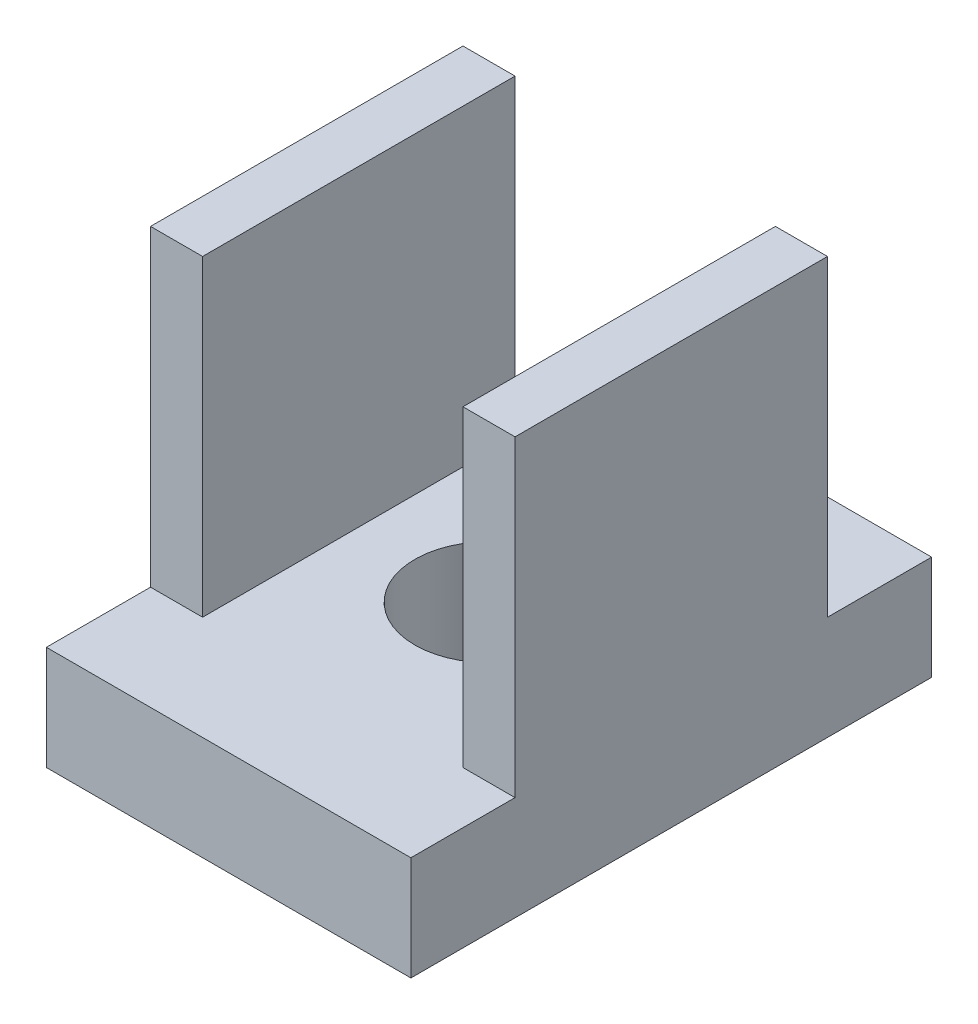
ISO-10303-21;
HEADER;
FILE_DESCRIPTION(('STEP AP214'),'2;1');
FILE_NAME('part.step','',(''),(''),'','','');
FILE_SCHEMA(('AUTOMOTIVE_DESIGN { 1 0 10303 214 1 1 1 1 }'));
ENDSEC;
DATA;
#1=APPLICATION_CONTEXT('core data for automotive mechanical design processes');
#2=APPLICATION_PROTOCOL_DEFINITION('international standard','automotive_design',2000,#1);
#3=PRODUCT_CONTEXT('',#1,'mechanical');
#4=PRODUCT('Part','Part','',(#3));
#5=PRODUCT_RELATED_PRODUCT_CATEGORY('part','',(#4));
#6=PRODUCT_DEFINITION_FORMATION('','',#4);
#7=PRODUCT_DEFINITION_CONTEXT('part definition',#1,'design');
#8=PRODUCT_DEFINITION('design','',#6,#7);
#9=PRODUCT_DEFINITION_SHAPE('','',#8);
#10=(LENGTH_UNIT() NAMED_UNIT(*) SI_UNIT(.MILLI.,.METRE.));
#11=(NAMED_UNIT(*) PLANE_ANGLE_UNIT() SI_UNIT($,.RADIAN.));
#12=(NAMED_UNIT(*) SI_UNIT($,.STERADIAN.) SOLID_ANGLE_UNIT());
#13=UNCERTAINTY_MEASURE_WITH_UNIT(LENGTH_MEASURE(1.E-05),#10,'distance_accuracy_value','');
#14=(GEOMETRIC_REPRESENTATION_CONTEXT(3) GLOBAL_UNCERTAINTY_ASSIGNED_CONTEXT((#13)) GLOBAL_UNIT_ASSIGNED_CONTEXT((#10,
#11,#12)) REPRESENTATION_CONTEXT('',''));
#15=CARTESIAN_POINT('',(0.,0.,0.));
#16=DIRECTION('',(0.,0.,1.));
#17=DIRECTION('',(1.,0.,0.));
#18=AXIS2_PLACEMENT_3D('',#15,#16,#17);
#19=CARTESIAN_POINT('',(0.,2.,0.));
#20=DIRECTION('',(0.,1.,0.));
#21=DIRECTION('',(0.,0.,1.));
#22=AXIS2_PLACEMENT_3D('',#19,#20,#21);
#23=PLANE('',#22);
#24=CARTESIAN_POINT('',(0.,2.,0.));
#25=DIRECTION('',(0.,1.,0.));
#26=DIRECTION('',(0.,0.,1.));
#27=AXIS2_PLACEMENT_3D('',#24,#25,#26);
#28=CIRCLE('',#27,1.425);
#29=CARTESIAN_POINT('',(0.,2.,1.425));
#30=VERTEX_POINT('',#29);
#31=EDGE_CURVE('E200',#30,#30,#28,.T.);
#32=ORIENTED_EDGE('',*,*,#31,.F.);
#33=EDGE_LOOP('',(#32));
#34=FACE_BOUND('',#33,.T.);
#35=DIRECTION('',(0.,0.,1.));
#36=VECTOR('',#35,1.);
#37=CARTESIAN_POINT('',(2.5,2.,-3.));
#38=LINE('',#37,#36);
#39=CARTESIAN_POINT('',(2.5,2.,-3.));
#40=VERTEX_POINT('',#39);
#41=CARTESIAN_POINT('',(2.5,2.,3.));
#42=VERTEX_POINT('',#41);
#43=EDGE_CURVE('E410',#40,#42,#38,.T.);
#44=ORIENTED_EDGE('',*,*,#43,.F.);
#45=DIRECTION('',(-1.,0.,0.));
#46=VECTOR('',#45,1.);
#47=CARTESIAN_POINT('',(3.5,2.,-3.));
#48=LINE('',#47,#46);
#49=CARTESIAN_POINT('',(3.5,2.,-3.));
#50=VERTEX_POINT('',#49);
#51=EDGE_CURVE('E267',#50,#40,#48,.T.);
#52=ORIENTED_EDGE('',*,*,#51,.F.);
#53=DIRECTION('',(0.,0.,-1.));
#54=VECTOR('',#53,1.);
#55=CARTESIAN_POINT('',(3.5,2.,-5.));
#56=LINE('',#55,#54);
#57=CARTESIAN_POINT('',(3.5,2.,-5.));
#58=VERTEX_POINT('',#57);
#59=EDGE_CURVE('E155',#50,#58,#56,.T.);
#60=ORIENTED_EDGE('',*,*,#59,.T.);
#61=DIRECTION('',(-1.,0.,0.));
#62=VECTOR('',#61,1.);
#63=CARTESIAN_POINT('',(-3.5,2.,-5.));
#64=LINE('',#63,#62);
#65=CARTESIAN_POINT('',(-3.5,2.,-5.));
#66=VERTEX_POINT('',#65);
#67=EDGE_CURVE('E213',#58,#66,#64,.T.);
#68=ORIENTED_EDGE('',*,*,#67,.T.);
#69=DIRECTION('',(0.,0.,1.));
#70=VECTOR('',#69,1.);
#71=CARTESIAN_POINT('',(-3.5,2.,-5.));
#72=LINE('',#71,#70);
#73=CARTESIAN_POINT('',(-3.5,2.,-3.));
#74=VERTEX_POINT('',#73);
#75=EDGE_CURVE('E217',#66,#74,#72,.T.);
#76=ORIENTED_EDGE('',*,*,#75,.T.);
#77=DIRECTION('',(-1.,0.,0.));
#78=VECTOR('',#77,1.);
#79=CARTESIAN_POINT('',(-3.5,2.,-3.));
#80=LINE('',#79,#78);
#81=CARTESIAN_POINT('',(-2.5,2.,-3.));
#82=VERTEX_POINT('',#81);
#83=EDGE_CURVE('E63',#82,#74,#80,.T.);
#84=ORIENTED_EDGE('',*,*,#83,.F.);
#85=DIRECTION('',(0.,0.,-1.));
#86=VECTOR('',#85,1.);
#87=CARTESIAN_POINT('',(-2.5,2.,3.));
#88=LINE('',#87,#86);
#89=CARTESIAN_POINT('',(-2.5,2.,3.));
#90=VERTEX_POINT('',#89);
#91=EDGE_CURVE('E162',#90,#82,#88,.T.);
#92=ORIENTED_EDGE('',*,*,#91,.F.);
#93=DIRECTION('',(1.,0.,0.));
#94=VECTOR('',#93,1.);
#95=CARTESIAN_POINT('',(-3.5,2.,3.));
#96=LINE('',#95,#94);
#97=CARTESIAN_POINT('',(-3.5,2.,3.));
#98=VERTEX_POINT('',#97);
#99=EDGE_CURVE('E157',#98,#90,#96,.T.);
#100=ORIENTED_EDGE('',*,*,#99,.F.);
#101=CARTESIAN_POINT('',(-3.5,2.,5.));
#102=VERTEX_POINT('',#101);
#103=EDGE_CURVE('E216',#98,#102,#72,.T.);
#104=ORIENTED_EDGE('',*,*,#103,.T.);
#105=DIRECTION('',(1.,0.,0.));
#106=VECTOR('',#105,1.);
#107=CARTESIAN_POINT('',(-3.5,2.,5.));
#108=LINE('',#107,#106);
#109=CARTESIAN_POINT('',(3.5,2.,5.));
#110=VERTEX_POINT('',#109);
#111=EDGE_CURVE('E220',#102,#110,#108,.T.);
#112=ORIENTED_EDGE('',*,*,#111,.T.);
#113=CARTESIAN_POINT('',(3.5,2.,3.));
#114=VERTEX_POINT('',#113);
#115=EDGE_CURVE('E209',#110,#114,#56,.T.);
#116=ORIENTED_EDGE('',*,*,#115,.T.);
#117=DIRECTION('',(1.,0.,0.));
#118=VECTOR('',#117,1.);
#119=CARTESIAN_POINT('',(3.5,2.,3.));
#120=LINE('',#119,#118);
#121=EDGE_CURVE('E150',#42,#114,#120,.T.);
#122=ORIENTED_EDGE('',*,*,#121,.F.);
#123=EDGE_LOOP('',(#44,#52,#60,#68,#76,#84,#92,#100,#104,#112,#116,#122));
#124=FACE_BOUND('',#123,.T.);
#125=ADVANCED_FACE('F39',(#34,#124),#23,.T.);
#126=CARTESIAN_POINT('',(3.5,2.,-5.));
#127=DIRECTION('',(-1.,0.,0.));
#128=DIRECTION('',(0.,0.,1.));
#129=AXIS2_PLACEMENT_3D('',#126,#127,#128);
#130=PLANE('',#129);
#131=DIRECTION('',(0.,0.,-1.));
#132=VECTOR('',#131,1.);
#133=CARTESIAN_POINT('',(3.5,0.,-5.));
#134=LINE('',#133,#132);
#135=CARTESIAN_POINT('',(3.5,0.,5.));
#136=VERTEX_POINT('',#135);
#137=CARTESIAN_POINT('',(3.5,0.,-5.));
#138=VERTEX_POINT('',#137);
#139=EDGE_CURVE('E205',#136,#138,#134,.T.);
#140=ORIENTED_EDGE('',*,*,#139,.T.);
#141=DIRECTION('',(0.,-1.,0.));
#142=VECTOR('',#141,1.);
#143=CARTESIAN_POINT('',(3.5,2.,-5.));
#144=LINE('',#143,#142);
#145=EDGE_CURVE('E11',#58,#138,#144,.T.);
#146=ORIENTED_EDGE('',*,*,#145,.F.);
#147=ORIENTED_EDGE('',*,*,#59,.F.);
#148=DIRECTION('',(0.,-1.,0.));
#149=VECTOR('',#148,1.);
#150=CARTESIAN_POINT('',(3.5,8.,-3.));
#151=LINE('',#150,#149);
#152=CARTESIAN_POINT('',(3.5,8.,-3.));
#153=VERTEX_POINT('',#152);
#154=EDGE_CURVE('E133',#153,#50,#151,.T.);
#155=ORIENTED_EDGE('',*,*,#154,.F.);
#156=DIRECTION('',(0.,0.,-1.));
#157=VECTOR('',#156,1.);
#158=CARTESIAN_POINT('',(3.5,8.,-3.));
#159=LINE('',#158,#157);
#160=CARTESIAN_POINT('',(3.5,8.,3.));
#161=VERTEX_POINT('',#160);
#162=EDGE_CURVE('E141',#161,#153,#159,.T.);
#163=ORIENTED_EDGE('',*,*,#162,.F.);
#164=DIRECTION('',(0.,-1.,0.));
#165=VECTOR('',#164,1.);
#166=CARTESIAN_POINT('',(3.5,8.,3.));
#167=LINE('',#166,#165);
#168=EDGE_CURVE('E260',#161,#114,#167,.T.);
#169=ORIENTED_EDGE('',*,*,#168,.T.);
#170=ORIENTED_EDGE('',*,*,#115,.F.);
#171=DIRECTION('',(0.,-1.,0.));
#172=VECTOR('',#171,1.);
#173=CARTESIAN_POINT('',(3.5,2.,5.));
#174=LINE('',#173,#172);
#175=EDGE_CURVE('E223',#110,#136,#174,.T.);
#176=ORIENTED_EDGE('',*,*,#175,.T.);
#177=EDGE_LOOP('',(#140,#146,#147,#155,#163,#169,#170,#176));
#178=FACE_BOUND('',#177,.T.);
#179=ADVANCED_FACE('F41',(#178),#130,.F.);
#180=CARTESIAN_POINT('',(-3.5,2.,-5.));
#181=DIRECTION('',(0.,0.,1.));
#182=DIRECTION('',(1.,0.,0.));
#183=AXIS2_PLACEMENT_3D('',#180,#181,#182);
#184=PLANE('',#183);
#185=DIRECTION('',(-1.,0.,0.));
#186=VECTOR('',#185,1.);
#187=CARTESIAN_POINT('',(-3.5,0.,-5.));
#188=LINE('',#187,#186);
#189=CARTESIAN_POINT('',(-3.5,0.,-5.));
#190=VERTEX_POINT('',#189);
#191=EDGE_CURVE('E226',#138,#190,#188,.T.);
#192=ORIENTED_EDGE('',*,*,#191,.T.);
#193=DIRECTION('',(0.,-1.,0.));
#194=VECTOR('',#193,1.);
#195=CARTESIAN_POINT('',(-3.5,2.,-5.));
#196=LINE('',#195,#194);
#197=EDGE_CURVE('E48',#66,#190,#196,.T.);
#198=ORIENTED_EDGE('',*,*,#197,.F.);
#199=ORIENTED_EDGE('',*,*,#67,.F.);
#200=ORIENTED_EDGE('',*,*,#145,.T.);
#201=EDGE_LOOP('',(#192,#198,#199,#200));
#202=FACE_BOUND('',#201,.T.);
#203=ADVANCED_FACE('F268',(#202),#184,.F.);
#204=CARTESIAN_POINT('',(-3.5,2.,-5.));
#205=DIRECTION('',(1.,0.,0.));
#206=DIRECTION('',(0.,0.,-1.));
#207=AXIS2_PLACEMENT_3D('',#204,#205,#206);
#208=PLANE('',#207);
#209=DIRECTION('',(0.,0.,1.));
#210=VECTOR('',#209,1.);
#211=CARTESIAN_POINT('',(-3.5,0.,-5.));
#212=LINE('',#211,#210);
#213=CARTESIAN_POINT('',(-3.5,0.,5.));
#214=VERTEX_POINT('',#213);
#215=EDGE_CURVE('E229',#190,#214,#212,.T.);
#216=ORIENTED_EDGE('',*,*,#215,.T.);
#217=DIRECTION('',(0.,-1.,0.));
#218=VECTOR('',#217,1.);
#219=CARTESIAN_POINT('',(-3.5,2.,5.));
#220=LINE('',#219,#218);
#221=EDGE_CURVE('E238',#102,#214,#220,.T.);
#222=ORIENTED_EDGE('',*,*,#221,.F.);
#223=ORIENTED_EDGE('',*,*,#103,.F.);
#224=DIRECTION('',(0.,-1.,0.));
#225=VECTOR('',#224,1.);
#226=CARTESIAN_POINT('',(-3.5,8.,3.));
#227=LINE('',#226,#225);
#228=CARTESIAN_POINT('',(-3.5,8.,3.));
#229=VERTEX_POINT('',#228);
#230=EDGE_CURVE('E196',#229,#98,#227,.T.);
#231=ORIENTED_EDGE('',*,*,#230,.F.);
#232=DIRECTION('',(0.,0.,1.));
#233=VECTOR('',#232,1.);
#234=CARTESIAN_POINT('',(-3.5,8.,3.));
#235=LINE('',#234,#233);
#236=CARTESIAN_POINT('',(-3.5,8.,-3.));
#237=VERTEX_POINT('',#236);
#238=EDGE_CURVE('E167',#237,#229,#235,.T.);
#239=ORIENTED_EDGE('',*,*,#238,.F.);
#240=DIRECTION('',(0.,-1.,0.));
#241=VECTOR('',#240,1.);
#242=CARTESIAN_POINT('',(-3.5,8.,-3.));
#243=LINE('',#242,#241);
#244=EDGE_CURVE('E179',#237,#74,#243,.T.);
#245=ORIENTED_EDGE('',*,*,#244,.T.);
#246=ORIENTED_EDGE('',*,*,#75,.F.);
#247=ORIENTED_EDGE('',*,*,#197,.T.);
#248=EDGE_LOOP('',(#216,#222,#223,#231,#239,#245,#246,#247));
#249=FACE_BOUND('',#248,.T.);
#250=ADVANCED_FACE('F247',(#249),#208,.F.);
#251=CARTESIAN_POINT('',(-3.5,2.,5.));
#252=DIRECTION('',(0.,0.,-1.));
#253=DIRECTION('',(-1.,0.,0.));
#254=AXIS2_PLACEMENT_3D('',#251,#252,#253);
#255=PLANE('',#254);
#256=DIRECTION('',(1.,0.,0.));
#257=VECTOR('',#256,1.);
#258=CARTESIAN_POINT('',(-3.5,0.,5.));
#259=LINE('',#258,#257);
#260=EDGE_CURVE('E232',#214,#136,#259,.T.);
#261=ORIENTED_EDGE('',*,*,#260,.T.);
#262=ORIENTED_EDGE('',*,*,#175,.F.);
#263=ORIENTED_EDGE('',*,*,#111,.F.);
#264=ORIENTED_EDGE('',*,*,#221,.T.);
#265=EDGE_LOOP('',(#261,#262,#263,#264));
#266=FACE_BOUND('',#265,.T.);
#267=ADVANCED_FACE('F257',(#266),#255,.F.);
#268=CARTESIAN_POINT('',(0.,0.,0.));
#269=DIRECTION('',(0.,1.,0.));
#270=DIRECTION('',(0.,0.,1.));
#271=AXIS2_PLACEMENT_3D('',#268,#269,#270);
#272=PLANE('',#271);
#273=CARTESIAN_POINT('',(0.,0.,0.));
#274=DIRECTION('',(0.,1.,0.));
#275=DIRECTION('',(0.,0.,1.));
#276=AXIS2_PLACEMENT_3D('',#273,#274,#275);
#277=CIRCLE('',#276,1.425);
#278=CARTESIAN_POINT('',(0.,0.,1.425));
#279=VERTEX_POINT('',#278);
#280=EDGE_CURVE('E201',#279,#279,#277,.T.);
#281=ORIENTED_EDGE('',*,*,#280,.T.);
#282=EDGE_LOOP('',(#281));
#283=FACE_BOUND('',#282,.T.);
#284=ORIENTED_EDGE('',*,*,#139,.F.);
#285=ORIENTED_EDGE('',*,*,#260,.F.);
#286=ORIENTED_EDGE('',*,*,#215,.F.);
#287=ORIENTED_EDGE('',*,*,#191,.F.);
#288=EDGE_LOOP('',(#284,#285,#286,#287));
#289=FACE_BOUND('',#288,.T.);
#290=ADVANCED_FACE('F254',(#283,#289),#272,.F.);
#291=CARTESIAN_POINT('',(0.,0.,0.));
#292=DIRECTION('',(0.,1.,0.));
#293=DIRECTION('',(0.,0.,1.));
#294=AXIS2_PLACEMENT_3D('',#291,#292,#293);
#295=CYLINDRICAL_SURFACE('',#294,1.425);
#296=ORIENTED_EDGE('',*,*,#280,.F.);
#297=EDGE_LOOP('',(#296));
#298=FACE_BOUND('',#297,.T.);
#299=ORIENTED_EDGE('',*,*,#31,.T.);
#300=EDGE_LOOP('',(#299));
#301=FACE_BOUND('',#300,.T.);
#302=ADVANCED_FACE('F283',(#298,#301),#295,.F.);
#303=CARTESIAN_POINT('',(-3.5,8.,3.));
#304=DIRECTION('',(0.,0.,-1.));
#305=DIRECTION('',(-1.,0.,0.));
#306=AXIS2_PLACEMENT_3D('',#303,#304,#305);
#307=PLANE('',#306);
#308=ORIENTED_EDGE('',*,*,#99,.T.);
#309=DIRECTION('',(0.,-1.,0.));
#310=VECTOR('',#309,1.);
#311=CARTESIAN_POINT('',(-2.5,8.,3.));
#312=LINE('',#311,#310);
#313=CARTESIAN_POINT('',(-2.5,8.,3.));
#314=VERTEX_POINT('',#313);
#315=EDGE_CURVE('E192',#314,#90,#312,.T.);
#316=ORIENTED_EDGE('',*,*,#315,.F.);
#317=DIRECTION('',(1.,0.,0.));
#318=VECTOR('',#317,1.);
#319=CARTESIAN_POINT('',(-3.5,8.,3.));
#320=LINE('',#319,#318);
#321=EDGE_CURVE('E171',#229,#314,#320,.T.);
#322=ORIENTED_EDGE('',*,*,#321,.F.);
#323=ORIENTED_EDGE('',*,*,#230,.T.);
#324=EDGE_LOOP('',(#308,#316,#322,#323));
#325=FACE_BOUND('',#324,.T.);
#326=ADVANCED_FACE('F303',(#325),#307,.F.);
#327=CARTESIAN_POINT('',(-2.5,8.,3.));
#328=DIRECTION('',(-1.,0.,0.));
#329=DIRECTION('',(0.,0.,1.));
#330=AXIS2_PLACEMENT_3D('',#327,#328,#329);
#331=PLANE('',#330);
#332=ORIENTED_EDGE('',*,*,#91,.T.);
#333=DIRECTION('',(0.,-1.,0.));
#334=VECTOR('',#333,1.);
#335=CARTESIAN_POINT('',(-2.5,8.,-3.));
#336=LINE('',#335,#334);
#337=CARTESIAN_POINT('',(-2.5,8.,-3.));
#338=VERTEX_POINT('',#337);
#339=EDGE_CURVE('E188',#338,#82,#336,.T.);
#340=ORIENTED_EDGE('',*,*,#339,.F.);
#341=DIRECTION('',(0.,0.,-1.));
#342=VECTOR('',#341,1.);
#343=CARTESIAN_POINT('',(-2.5,8.,3.));
#344=LINE('',#343,#342);
#345=EDGE_CURVE('E174',#314,#338,#344,.T.);
#346=ORIENTED_EDGE('',*,*,#345,.F.);
#347=ORIENTED_EDGE('',*,*,#315,.T.);
#348=EDGE_LOOP('',(#332,#340,#346,#347));
#349=FACE_BOUND('',#348,.T.);
#350=ADVANCED_FACE('F310',(#349),#331,.F.);
#351=CARTESIAN_POINT('',(-3.5,8.,-3.));
#352=DIRECTION('',(0.,0.,1.));
#353=DIRECTION('',(1.,0.,0.));
#354=AXIS2_PLACEMENT_3D('',#351,#352,#353);
#355=PLANE('',#354);
#356=ORIENTED_EDGE('',*,*,#83,.T.);
#357=ORIENTED_EDGE('',*,*,#244,.F.);
#358=DIRECTION('',(-1.,0.,0.));
#359=VECTOR('',#358,1.);
#360=CARTESIAN_POINT('',(-3.5,8.,-3.));
#361=LINE('',#360,#359);
#362=EDGE_CURVE('E177',#338,#237,#361,.T.);
#363=ORIENTED_EDGE('',*,*,#362,.F.);
#364=ORIENTED_EDGE('',*,*,#339,.T.);
#365=EDGE_LOOP('',(#356,#357,#363,#364));
#366=FACE_BOUND('',#365,.T.);
#367=ADVANCED_FACE('F317',(#366),#355,.F.);
#368=CARTESIAN_POINT('',(0.,8.,0.));
#369=DIRECTION('',(0.,-1.,0.));
#370=DIRECTION('',(0.,0.,-1.));
#371=AXIS2_PLACEMENT_3D('',#368,#369,#370);
#372=PLANE('',#371);
#373=ORIENTED_EDGE('',*,*,#238,.T.);
#374=ORIENTED_EDGE('',*,*,#321,.T.);
#375=ORIENTED_EDGE('',*,*,#345,.T.);
#376=ORIENTED_EDGE('',*,*,#362,.T.);
#377=EDGE_LOOP('',(#373,#374,#375,#376));
#378=FACE_BOUND('',#377,.T.);
#379=ADVANCED_FACE('F325',(#378),#372,.F.);
#380=CARTESIAN_POINT('',(3.5,8.,-3.));
#381=DIRECTION('',(0.,0.,1.));
#382=DIRECTION('',(1.,0.,0.));
#383=AXIS2_PLACEMENT_3D('',#380,#381,#382);
#384=PLANE('',#383);
#385=ORIENTED_EDGE('',*,*,#51,.T.);
#386=DIRECTION('',(0.,-1.,0.));
#387=VECTOR('',#386,1.);
#388=CARTESIAN_POINT('',(2.5,8.,-3.));
#389=LINE('',#388,#387);
#390=CARTESIAN_POINT('',(2.5,8.,-3.));
#391=VERTEX_POINT('',#390);
#392=EDGE_CURVE('E136',#391,#40,#389,.T.);
#393=ORIENTED_EDGE('',*,*,#392,.F.);
#394=DIRECTION('',(-1.,0.,0.));
#395=VECTOR('',#394,1.);
#396=CARTESIAN_POINT('',(3.5,8.,-3.));
#397=LINE('',#396,#395);
#398=EDGE_CURVE('E129',#153,#391,#397,.T.);
#399=ORIENTED_EDGE('',*,*,#398,.F.);
#400=ORIENTED_EDGE('',*,*,#154,.T.);
#401=EDGE_LOOP('',(#385,#393,#399,#400));
#402=FACE_BOUND('',#401,.T.);
#403=ADVANCED_FACE('F131',(#402),#384,.F.);
#404=CARTESIAN_POINT('',(2.5,8.,-3.));
#405=DIRECTION('',(1.,0.,0.));
#406=DIRECTION('',(0.,0.,-1.));
#407=AXIS2_PLACEMENT_3D('',#404,#405,#406);
#408=PLANE('',#407);
#409=ORIENTED_EDGE('',*,*,#43,.T.);
#410=DIRECTION('',(0.,-1.,0.));
#411=VECTOR('',#410,1.);
#412=CARTESIAN_POINT('',(2.5,8.,3.));
#413=LINE('',#412,#411);
#414=CARTESIAN_POINT('',(2.5,8.,3.));
#415=VERTEX_POINT('',#414);
#416=EDGE_CURVE('E55',#415,#42,#413,.T.);
#417=ORIENTED_EDGE('',*,*,#416,.F.);
#418=DIRECTION('',(0.,0.,1.));
#419=VECTOR('',#418,1.);
#420=CARTESIAN_POINT('',(2.5,8.,-3.));
#421=LINE('',#420,#419);
#422=EDGE_CURVE('E140',#391,#415,#421,.T.);
#423=ORIENTED_EDGE('',*,*,#422,.F.);
#424=ORIENTED_EDGE('',*,*,#392,.T.);
#425=EDGE_LOOP('',(#409,#417,#423,#424));
#426=FACE_BOUND('',#425,.T.);
#427=ADVANCED_FACE('F340',(#426),#408,.F.);
#428=CARTESIAN_POINT('',(3.5,8.,3.));
#429=DIRECTION('',(0.,0.,-1.));
#430=DIRECTION('',(-1.,0.,0.));
#431=AXIS2_PLACEMENT_3D('',#428,#429,#430);
#432=PLANE('',#431);
#433=ORIENTED_EDGE('',*,*,#121,.T.);
#434=ORIENTED_EDGE('',*,*,#168,.F.);
#435=DIRECTION('',(1.,0.,0.));
#436=VECTOR('',#435,1.);
#437=CARTESIAN_POINT('',(3.5,8.,3.));
#438=LINE('',#437,#436);
#439=EDGE_CURVE('E145',#415,#161,#438,.T.);
#440=ORIENTED_EDGE('',*,*,#439,.F.);
#441=ORIENTED_EDGE('',*,*,#416,.T.);
#442=EDGE_LOOP('',(#433,#434,#440,#441));
#443=FACE_BOUND('',#442,.T.);
#444=ADVANCED_FACE('F347',(#443),#432,.F.);
#445=CARTESIAN_POINT('',(0.,8.,0.));
#446=DIRECTION('',(0.,-1.,0.));
#447=DIRECTION('',(0.,0.,-1.));
#448=AXIS2_PLACEMENT_3D('',#445,#446,#447);
#449=PLANE('',#448);
#450=ORIENTED_EDGE('',*,*,#162,.T.);
#451=ORIENTED_EDGE('',*,*,#398,.T.);
#452=ORIENTED_EDGE('',*,*,#422,.T.);
#453=ORIENTED_EDGE('',*,*,#439,.T.);
#454=EDGE_LOOP('',(#450,#451,#452,#453));
#455=FACE_BOUND('',#454,.T.);
#456=ADVANCED_FACE('F144',(#455),#449,.F.);
#457=CLOSED_SHELL('',(#125,#179,#203,#250,#267,#290,#302,#326,#350,#367,#379,#403,#427,#444,#456));
#458=MANIFOLD_SOLID_BREP('B2',#457);
#459=ADVANCED_BREP_SHAPE_REPRESENTATION('',(#18,#458),#14);
#460=SHAPE_DEFINITION_REPRESENTATION(#9,#459);
ENDSEC;
END-ISO-10303-21;
